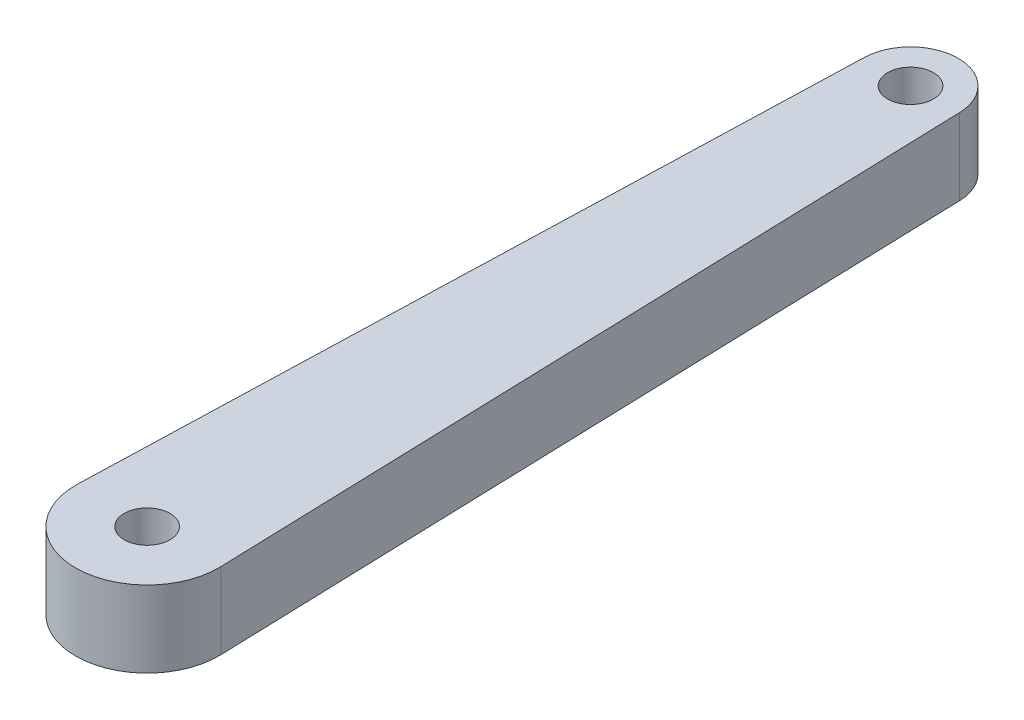
ISO-10303-21;
HEADER;
FILE_DESCRIPTION(('STEP AP214'),'2;1');
FILE_NAME('part.step','',(''),(''),'','','');
FILE_SCHEMA(('AUTOMOTIVE_DESIGN { 1 0 10303 214 1 1 1 1 }'));
ENDSEC;
DATA;
#1=APPLICATION_CONTEXT('core data for automotive mechanical design processes');
#2=APPLICATION_PROTOCOL_DEFINITION('international standard','automotive_design',2000,#1);
#3=PRODUCT_CONTEXT('',#1,'mechanical');
#4=PRODUCT('Part','Part','',(#3));
#5=PRODUCT_RELATED_PRODUCT_CATEGORY('part','',(#4));
#6=PRODUCT_DEFINITION_FORMATION('','',#4);
#7=PRODUCT_DEFINITION_CONTEXT('part definition',#1,'design');
#8=PRODUCT_DEFINITION('design','',#6,#7);
#9=PRODUCT_DEFINITION_SHAPE('','',#8);
#10=(LENGTH_UNIT() NAMED_UNIT(*) SI_UNIT(.MILLI.,.METRE.));
#11=(NAMED_UNIT(*) PLANE_ANGLE_UNIT() SI_UNIT($,.RADIAN.));
#12=(NAMED_UNIT(*) SI_UNIT($,.STERADIAN.) SOLID_ANGLE_UNIT());
#13=UNCERTAINTY_MEASURE_WITH_UNIT(LENGTH_MEASURE(1.E-05),#10,'distance_accuracy_value','');
#14=(GEOMETRIC_REPRESENTATION_CONTEXT(3) GLOBAL_UNCERTAINTY_ASSIGNED_CONTEXT((#13)) GLOBAL_UNIT_ASSIGNED_CONTEXT((#10,
#11,#12)) REPRESENTATION_CONTEXT('',''));
#15=CARTESIAN_POINT('',(0.,0.,0.));
#16=DIRECTION('',(0.,0.,1.));
#17=DIRECTION('',(1.,0.,0.));
#18=AXIS2_PLACEMENT_3D('',#15,#16,#17);
#19=CARTESIAN_POINT('',(-3.74816849805925,4.,-0.1171875));
#20=DIRECTION('',(-0.999511599482467,0.,-0.03125));
#21=DIRECTION('',(-0.03125,0.,0.999511599482467));
#22=AXIS2_PLACEMENT_3D('',#19,#20,#21);
#23=PLANE('',#22);
#24=DIRECTION('',(0.03125,0.,-0.999511599482467));
#25=VECTOR('',#24,1.);
#26=CARTESIAN_POINT('',(-3.74816849805925,0.,-0.1171875));
#27=LINE('',#26,#25);
#28=CARTESIAN_POINT('',(-3.74816849805925,0.,-0.1171875));
#29=VERTEX_POINT('',#28);
#30=CARTESIAN_POINT('',(-2.49877899870617,0.,-40.078125));
#31=VERTEX_POINT('',#30);
#32=EDGE_CURVE('E117',#29,#31,#27,.T.);
#33=ORIENTED_EDGE('',*,*,#32,.F.);
#34=DIRECTION('',(0.,-1.,0.));
#35=VECTOR('',#34,1.);
#36=CARTESIAN_POINT('',(-3.74816849805925,4.,-0.1171875));
#37=LINE('',#36,#35);
#38=CARTESIAN_POINT('',(-3.74816849805925,4.,-0.1171875));
#39=VERTEX_POINT('',#38);
#40=EDGE_CURVE('E11',#39,#29,#37,.T.);
#41=ORIENTED_EDGE('',*,*,#40,.F.);
#42=DIRECTION('',(0.03125,0.,-0.999511599482467));
#43=VECTOR('',#42,1.);
#44=CARTESIAN_POINT('',(-3.74816849805925,4.,-0.1171875));
#45=LINE('',#44,#43);
#46=CARTESIAN_POINT('',(-2.49877899870617,4.,-40.078125));
#47=VERTEX_POINT('',#46);
#48=EDGE_CURVE('E93',#39,#47,#45,.T.);
#49=ORIENTED_EDGE('',*,*,#48,.T.);
#50=DIRECTION('',(0.,-1.,0.));
#51=VECTOR('',#50,1.);
#52=CARTESIAN_POINT('',(-2.49877899870617,4.,-40.078125));
#53=LINE('',#52,#51);
#54=EDGE_CURVE('E81',#47,#31,#53,.T.);
#55=ORIENTED_EDGE('',*,*,#54,.T.);
#56=EDGE_LOOP('',(#33,#41,#49,#55));
#57=FACE_BOUND('',#56,.T.);
#58=ADVANCED_FACE('F41',(#57),#23,.T.);
#59=CARTESIAN_POINT('',(0.,4.,0.));
#60=DIRECTION('',(0.,-1.,0.));
#61=DIRECTION('',(0.,0.,-1.));
#62=AXIS2_PLACEMENT_3D('',#59,#60,#61);
#63=CYLINDRICAL_SURFACE('',#62,3.75);
#64=CARTESIAN_POINT('',(0.,0.,0.));
#65=DIRECTION('',(0.,1.,0.));
#66=DIRECTION('',(0.,0.,1.));
#67=AXIS2_PLACEMENT_3D('',#64,#65,#66);
#68=CIRCLE('',#67,3.75);
#69=CARTESIAN_POINT('',(3.74816849805925,0.,-0.1171875));
#70=VERTEX_POINT('',#69);
#71=EDGE_CURVE('E99',#29,#70,#68,.T.);
#72=ORIENTED_EDGE('',*,*,#71,.T.);
#73=DIRECTION('',(0.,-1.,0.));
#74=VECTOR('',#73,1.);
#75=CARTESIAN_POINT('',(3.74816849805925,4.,-0.1171875));
#76=LINE('',#75,#74);
#77=CARTESIAN_POINT('',(3.74816849805925,4.,-0.1171875));
#78=VERTEX_POINT('',#77);
#79=EDGE_CURVE('E50',#78,#70,#76,.T.);
#80=ORIENTED_EDGE('',*,*,#79,.F.);
#81=CARTESIAN_POINT('',(0.,4.,0.));
#82=DIRECTION('',(0.,1.,0.));
#83=DIRECTION('',(0.,0.,1.));
#84=AXIS2_PLACEMENT_3D('',#81,#82,#83);
#85=CIRCLE('',#84,3.75);
#86=EDGE_CURVE('E87',#39,#78,#85,.T.);
#87=ORIENTED_EDGE('',*,*,#86,.F.);
#88=ORIENTED_EDGE('',*,*,#40,.T.);
#89=EDGE_LOOP('',(#72,#80,#87,#88));
#90=FACE_BOUND('',#89,.T.);
#91=ADVANCED_FACE('F97',(#90),#63,.T.);
#92=CARTESIAN_POINT('',(3.74816849805925,4.,-0.1171875));
#93=DIRECTION('',(-0.999511599482467,0.,0.03125));
#94=DIRECTION('',(0.03125,0.,0.999511599482467));
#95=AXIS2_PLACEMENT_3D('',#92,#93,#94);
#96=PLANE('',#95);
#97=DIRECTION('',(-0.03125,0.,-0.999511599482467));
#98=VECTOR('',#97,1.);
#99=CARTESIAN_POINT('',(3.74816849805925,0.,-0.1171875));
#100=LINE('',#99,#98);
#101=CARTESIAN_POINT('',(2.49877899870617,0.,-40.078125));
#102=VERTEX_POINT('',#101);
#103=EDGE_CURVE('E74',#70,#102,#100,.T.);
#104=ORIENTED_EDGE('',*,*,#103,.T.);
#105=DIRECTION('',(0.,-1.,0.));
#106=VECTOR('',#105,1.);
#107=CARTESIAN_POINT('',(2.49877899870617,4.,-40.078125));
#108=LINE('',#107,#106);
#109=CARTESIAN_POINT('',(2.49877899870617,4.,-40.078125));
#110=VERTEX_POINT('',#109);
#111=EDGE_CURVE('E101',#110,#102,#108,.T.);
#112=ORIENTED_EDGE('',*,*,#111,.F.);
#113=DIRECTION('',(-0.03125,0.,-0.999511599482467));
#114=VECTOR('',#113,1.);
#115=CARTESIAN_POINT('',(3.74816849805925,4.,-0.1171875));
#116=LINE('',#115,#114);
#117=EDGE_CURVE('E92',#78,#110,#116,.T.);
#118=ORIENTED_EDGE('',*,*,#117,.F.);
#119=ORIENTED_EDGE('',*,*,#79,.T.);
#120=EDGE_LOOP('',(#104,#112,#118,#119));
#121=FACE_BOUND('',#120,.T.);
#122=ADVANCED_FACE('F102',(#121),#96,.F.);
#123=CARTESIAN_POINT('',(0.,4.,-40.));
#124=DIRECTION('',(0.,-1.,0.));
#125=DIRECTION('',(0.,0.,-1.));
#126=AXIS2_PLACEMENT_3D('',#123,#124,#125);
#127=CYLINDRICAL_SURFACE('',#126,1.2);
#128=CARTESIAN_POINT('',(0.,4.,-40.));
#129=DIRECTION('',(0.,1.,0.));
#130=DIRECTION('',(0.,0.,1.));
#131=AXIS2_PLACEMENT_3D('',#128,#129,#130);
#132=CIRCLE('',#131,1.2);
#133=CARTESIAN_POINT('',(0.,4.,-38.8));
#134=VERTEX_POINT('',#133);
#135=EDGE_CURVE('E106',#134,#134,#132,.T.);
#136=ORIENTED_EDGE('',*,*,#135,.T.);
#137=EDGE_LOOP('',(#136));
#138=FACE_BOUND('',#137,.T.);
#139=CARTESIAN_POINT('',(0.,0.,-40.));
#140=DIRECTION('',(0.,1.,0.));
#141=DIRECTION('',(0.,0.,1.));
#142=AXIS2_PLACEMENT_3D('',#139,#140,#141);
#143=CIRCLE('',#142,1.2);
#144=CARTESIAN_POINT('',(0.,0.,-38.8));
#145=VERTEX_POINT('',#144);
#146=EDGE_CURVE('E128',#145,#145,#143,.T.);
#147=ORIENTED_EDGE('',*,*,#146,.F.);
#148=EDGE_LOOP('',(#147));
#149=FACE_BOUND('',#148,.T.);
#150=ADVANCED_FACE('F152',(#138,#149),#127,.F.);
#151=CARTESIAN_POINT('',(0.,4.,-40.));
#152=DIRECTION('',(0.,-1.,0.));
#153=DIRECTION('',(0.,0.,-1.));
#154=AXIS2_PLACEMENT_3D('',#151,#152,#153);
#155=CYLINDRICAL_SURFACE('',#154,2.5);
#156=CARTESIAN_POINT('',(0.,0.,-40.));
#157=DIRECTION('',(0.,1.,0.));
#158=DIRECTION('',(0.,0.,1.));
#159=AXIS2_PLACEMENT_3D('',#156,#157,#158);
#160=CIRCLE('',#159,2.5);
#161=EDGE_CURVE('E125',#102,#31,#160,.T.);
#162=ORIENTED_EDGE('',*,*,#161,.T.);
#163=ORIENTED_EDGE('',*,*,#54,.F.);
#164=CARTESIAN_POINT('',(0.,4.,-40.));
#165=DIRECTION('',(0.,1.,0.));
#166=DIRECTION('',(0.,0.,1.));
#167=AXIS2_PLACEMENT_3D('',#164,#165,#166);
#168=CIRCLE('',#167,2.5);
#169=EDGE_CURVE('E58',#110,#47,#168,.T.);
#170=ORIENTED_EDGE('',*,*,#169,.F.);
#171=ORIENTED_EDGE('',*,*,#111,.T.);
#172=EDGE_LOOP('',(#162,#163,#170,#171));
#173=FACE_BOUND('',#172,.T.);
#174=ADVANCED_FACE('F141',(#173),#155,.T.);
#175=CARTESIAN_POINT('',(0.,4.,0.));
#176=DIRECTION('',(0.,-1.,0.));
#177=DIRECTION('',(0.,0.,-1.));
#178=AXIS2_PLACEMENT_3D('',#175,#176,#177);
#179=CYLINDRICAL_SURFACE('',#178,1.2);
#180=CARTESIAN_POINT('',(0.,4.,0.));
#181=DIRECTION('',(0.,1.,0.));
#182=DIRECTION('',(0.,0.,1.));
#183=AXIS2_PLACEMENT_3D('',#180,#181,#182);
#184=CIRCLE('',#183,1.2);
#185=CARTESIAN_POINT('',(0.,4.,1.2));
#186=VERTEX_POINT('',#185);
#187=EDGE_CURVE('E113',#186,#186,#184,.T.);
#188=ORIENTED_EDGE('',*,*,#187,.T.);
#189=EDGE_LOOP('',(#188));
#190=FACE_BOUND('',#189,.T.);
#191=CARTESIAN_POINT('',(0.,0.,0.));
#192=DIRECTION('',(0.,1.,0.));
#193=DIRECTION('',(0.,0.,1.));
#194=AXIS2_PLACEMENT_3D('',#191,#192,#193);
#195=CIRCLE('',#194,1.2);
#196=CARTESIAN_POINT('',(0.,0.,1.2));
#197=VERTEX_POINT('',#196);
#198=EDGE_CURVE('E132',#197,#197,#195,.T.);
#199=ORIENTED_EDGE('',*,*,#198,.F.);
#200=EDGE_LOOP('',(#199));
#201=FACE_BOUND('',#200,.T.);
#202=ADVANCED_FACE('F157',(#190,#201),#179,.F.);
#203=CARTESIAN_POINT('',(0.,4.,0.));
#204=DIRECTION('',(0.,1.,0.));
#205=DIRECTION('',(0.,0.,1.));
#206=AXIS2_PLACEMENT_3D('',#203,#204,#205);
#207=PLANE('',#206);
#208=ORIENTED_EDGE('',*,*,#48,.F.);
#209=ORIENTED_EDGE('',*,*,#86,.T.);
#210=ORIENTED_EDGE('',*,*,#117,.T.);
#211=ORIENTED_EDGE('',*,*,#169,.T.);
#212=EDGE_LOOP('',(#208,#209,#210,#211));
#213=FACE_BOUND('',#212,.T.);
#214=ORIENTED_EDGE('',*,*,#135,.F.);
#215=EDGE_LOOP('',(#214));
#216=FACE_BOUND('',#215,.T.);
#217=ORIENTED_EDGE('',*,*,#187,.F.);
#218=EDGE_LOOP('',(#217));
#219=FACE_BOUND('',#218,.T.);
#220=ADVANCED_FACE('F89',(#213,#216,#219),#207,.T.);
#221=CARTESIAN_POINT('',(0.,0.,0.));
#222=DIRECTION('',(0.,1.,0.));
#223=DIRECTION('',(0.,0.,1.));
#224=AXIS2_PLACEMENT_3D('',#221,#222,#223);
#225=PLANE('',#224);
#226=ORIENTED_EDGE('',*,*,#32,.T.);
#227=ORIENTED_EDGE('',*,*,#161,.F.);
#228=ORIENTED_EDGE('',*,*,#103,.F.);
#229=ORIENTED_EDGE('',*,*,#71,.F.);
#230=EDGE_LOOP('',(#226,#227,#228,#229));
#231=FACE_BOUND('',#230,.T.);
#232=ORIENTED_EDGE('',*,*,#146,.T.);
#233=EDGE_LOOP('',(#232));
#234=FACE_BOUND('',#233,.T.);
#235=ORIENTED_EDGE('',*,*,#198,.T.);
#236=EDGE_LOOP('',(#235));
#237=FACE_BOUND('',#236,.T.);
#238=ADVANCED_FACE('F143',(#231,#234,#237),#225,.F.);
#239=CLOSED_SHELL('',(#58,#91,#122,#150,#174,#202,#220,#238));
#240=MANIFOLD_SOLID_BREP('B2',#239);
#241=ADVANCED_BREP_SHAPE_REPRESENTATION('',(#18,#240),#14);
#242=SHAPE_DEFINITION_REPRESENTATION(#9,#241);
ENDSEC;
END-ISO-10303-21;
